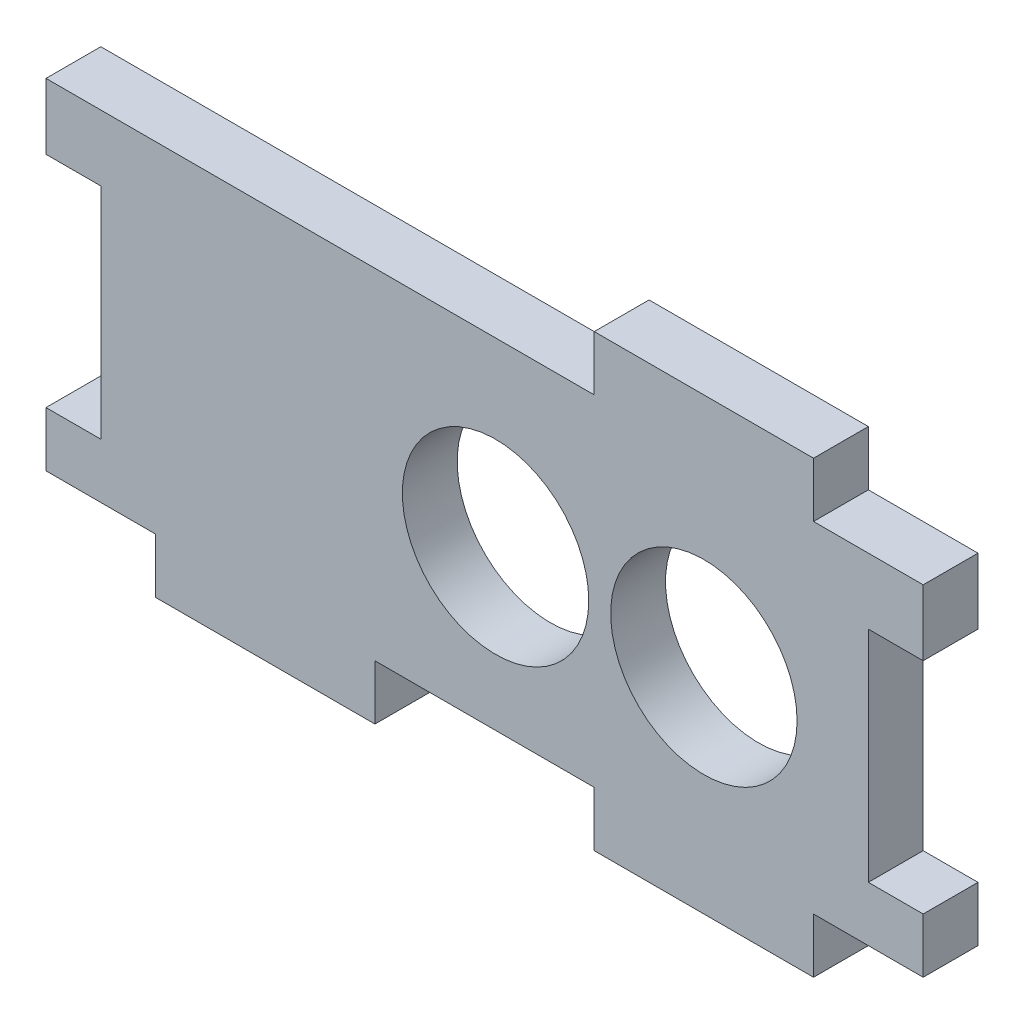
ISO-10303-21;
HEADER;
FILE_DESCRIPTION(('STEP AP214'),'2;1');
FILE_NAME('part.step','',(''),(''),'','','');
FILE_SCHEMA(('AUTOMOTIVE_DESIGN { 1 0 10303 214 1 1 1 1 }'));
ENDSEC;
DATA;
#1=APPLICATION_CONTEXT('core data for automotive mechanical design processes');
#2=APPLICATION_PROTOCOL_DEFINITION('international standard','automotive_design',2000,#1);
#3=PRODUCT_CONTEXT('',#1,'mechanical');
#4=PRODUCT('Part','Part','',(#3));
#5=PRODUCT_RELATED_PRODUCT_CATEGORY('part','',(#4));
#6=PRODUCT_DEFINITION_FORMATION('','',#4);
#7=PRODUCT_DEFINITION_CONTEXT('part definition',#1,'design');
#8=PRODUCT_DEFINITION('design','',#6,#7);
#9=PRODUCT_DEFINITION_SHAPE('','',#8);
#10=(LENGTH_UNIT() NAMED_UNIT(*) SI_UNIT(.MILLI.,.METRE.));
#11=(NAMED_UNIT(*) PLANE_ANGLE_UNIT() SI_UNIT($,.RADIAN.));
#12=(NAMED_UNIT(*) SI_UNIT($,.STERADIAN.) SOLID_ANGLE_UNIT());
#13=UNCERTAINTY_MEASURE_WITH_UNIT(LENGTH_MEASURE(1.E-05),#10,'distance_accuracy_value','');
#14=(GEOMETRIC_REPRESENTATION_CONTEXT(3) GLOBAL_UNCERTAINTY_ASSIGNED_CONTEXT((#13)) GLOBAL_UNIT_ASSIGNED_CONTEXT((#10,
#11,#12)) REPRESENTATION_CONTEXT('',''));
#15=CARTESIAN_POINT('',(0.,0.,0.));
#16=DIRECTION('',(0.,0.,1.));
#17=DIRECTION('',(1.,0.,0.));
#18=AXIS2_PLACEMENT_3D('',#15,#16,#17);
#19=CARTESIAN_POINT('',(50.,0.,-5.));
#20=DIRECTION('',(1.,0.,0.));
#21=DIRECTION('',(0.,0.,-1.));
#22=AXIS2_PLACEMENT_3D('',#19,#20,#21);
#23=PLANE('',#22);
#24=DIRECTION('',(0.,1.,0.));
#25=VECTOR('',#24,1.);
#26=CARTESIAN_POINT('',(50.,0.,0.));
#27=LINE('',#26,#25);
#28=CARTESIAN_POINT('',(50.,31.,0.));
#29=VERTEX_POINT('',#28);
#30=CARTESIAN_POINT('',(50.,36.,0.));
#31=VERTEX_POINT('',#30);
#32=EDGE_CURVE('E233',#29,#31,#27,.T.);
#33=ORIENTED_EDGE('',*,*,#32,.T.);
#34=DIRECTION('',(0.,0.,1.));
#35=VECTOR('',#34,1.);
#36=CARTESIAN_POINT('',(50.,36.,-5.));
#37=LINE('',#36,#35);
#38=CARTESIAN_POINT('',(50.,36.,-5.));
#39=VERTEX_POINT('',#38);
#40=EDGE_CURVE('E11',#39,#31,#37,.T.);
#41=ORIENTED_EDGE('',*,*,#40,.F.);
#42=DIRECTION('',(0.,1.,0.));
#43=VECTOR('',#42,1.);
#44=CARTESIAN_POINT('',(50.,0.,-5.));
#45=LINE('',#44,#43);
#46=CARTESIAN_POINT('',(50.,31.,-5.));
#47=VERTEX_POINT('',#46);
#48=EDGE_CURVE('E294',#47,#39,#45,.T.);
#49=ORIENTED_EDGE('',*,*,#48,.F.);
#50=DIRECTION('',(0.,0.,1.));
#51=VECTOR('',#50,1.);
#52=CARTESIAN_POINT('',(50.,31.,-5.));
#53=LINE('',#52,#51);
#54=EDGE_CURVE('E37',#47,#29,#53,.T.);
#55=ORIENTED_EDGE('',*,*,#54,.T.);
#56=EDGE_LOOP('',(#33,#41,#49,#55));
#57=FACE_BOUND('',#56,.T.);
#58=ADVANCED_FACE('F34',(#57),#23,.F.);
#59=CARTESIAN_POINT('',(0.,36.,-5.));
#60=DIRECTION('',(0.,-1.,0.));
#61=DIRECTION('',(0.,0.,-1.));
#62=AXIS2_PLACEMENT_3D('',#59,#60,#61);
#63=PLANE('',#62);
#64=DIRECTION('',(1.,0.,0.));
#65=VECTOR('',#64,1.);
#66=CARTESIAN_POINT('',(0.,36.,0.));
#67=LINE('',#66,#65);
#68=CARTESIAN_POINT('',(70.,36.,0.));
#69=VERTEX_POINT('',#68);
#70=EDGE_CURVE('E133',#31,#69,#67,.T.);
#71=ORIENTED_EDGE('',*,*,#70,.T.);
#72=DIRECTION('',(0.,0.,1.));
#73=VECTOR('',#72,1.);
#74=CARTESIAN_POINT('',(70.,36.,-5.));
#75=LINE('',#74,#73);
#76=CARTESIAN_POINT('',(70.,36.,-5.));
#77=VERTEX_POINT('',#76);
#78=EDGE_CURVE('E43',#77,#69,#75,.T.);
#79=ORIENTED_EDGE('',*,*,#78,.F.);
#80=DIRECTION('',(1.,0.,0.));
#81=VECTOR('',#80,1.);
#82=CARTESIAN_POINT('',(0.,36.,-5.));
#83=LINE('',#82,#81);
#84=EDGE_CURVE('E51',#39,#77,#83,.T.);
#85=ORIENTED_EDGE('',*,*,#84,.F.);
#86=ORIENTED_EDGE('',*,*,#40,.T.);
#87=EDGE_LOOP('',(#71,#79,#85,#86));
#88=FACE_BOUND('',#87,.T.);
#89=ADVANCED_FACE('F465',(#88),#63,.F.);
#90=CARTESIAN_POINT('',(70.,0.,-5.));
#91=DIRECTION('',(1.,0.,0.));
#92=DIRECTION('',(0.,0.,-1.));
#93=AXIS2_PLACEMENT_3D('',#90,#91,#92);
#94=PLANE('',#93);
#95=DIRECTION('',(0.,1.,0.));
#96=VECTOR('',#95,1.);
#97=CARTESIAN_POINT('',(70.,0.,0.));
#98=LINE('',#97,#96);
#99=CARTESIAN_POINT('',(70.,31.,0.));
#100=VERTEX_POINT('',#99);
#101=EDGE_CURVE('E207',#100,#69,#98,.T.);
#102=ORIENTED_EDGE('',*,*,#101,.F.);
#103=DIRECTION('',(0.,0.,1.));
#104=VECTOR('',#103,1.);
#105=CARTESIAN_POINT('',(70.,31.,-5.));
#106=LINE('',#105,#104);
#107=CARTESIAN_POINT('',(70.,31.,-5.));
#108=VERTEX_POINT('',#107);
#109=EDGE_CURVE('E202',#108,#100,#106,.T.);
#110=ORIENTED_EDGE('',*,*,#109,.F.);
#111=DIRECTION('',(0.,1.,0.));
#112=VECTOR('',#111,1.);
#113=CARTESIAN_POINT('',(70.,0.,-5.));
#114=LINE('',#113,#112);
#115=EDGE_CURVE('E206',#108,#77,#114,.T.);
#116=ORIENTED_EDGE('',*,*,#115,.T.);
#117=ORIENTED_EDGE('',*,*,#78,.T.);
#118=EDGE_LOOP('',(#102,#110,#116,#117));
#119=FACE_BOUND('',#118,.T.);
#120=ADVANCED_FACE('F204',(#119),#94,.T.);
#121=CARTESIAN_POINT('',(0.,31.,-5.));
#122=DIRECTION('',(0.,-1.,0.));
#123=DIRECTION('',(0.,0.,-1.));
#124=AXIS2_PLACEMENT_3D('',#121,#122,#123);
#125=PLANE('',#124);
#126=DIRECTION('',(1.,0.,0.));
#127=VECTOR('',#126,1.);
#128=CARTESIAN_POINT('',(0.,31.,0.));
#129=LINE('',#128,#127);
#130=CARTESIAN_POINT('',(80.,31.,0.));
#131=VERTEX_POINT('',#130);
#132=EDGE_CURVE('E239',#100,#131,#129,.T.);
#133=ORIENTED_EDGE('',*,*,#132,.T.);
#134=DIRECTION('',(0.,0.,1.));
#135=VECTOR('',#134,1.);
#136=CARTESIAN_POINT('',(80.,31.,-5.));
#137=LINE('',#136,#135);
#138=CARTESIAN_POINT('',(80.,31.,-5.));
#139=VERTEX_POINT('',#138);
#140=EDGE_CURVE('E211',#139,#131,#137,.T.);
#141=ORIENTED_EDGE('',*,*,#140,.F.);
#142=DIRECTION('',(1.,0.,0.));
#143=VECTOR('',#142,1.);
#144=CARTESIAN_POINT('',(0.,31.,-5.));
#145=LINE('',#144,#143);
#146=EDGE_CURVE('E214',#108,#139,#145,.T.);
#147=ORIENTED_EDGE('',*,*,#146,.F.);
#148=ORIENTED_EDGE('',*,*,#109,.T.);
#149=EDGE_LOOP('',(#133,#141,#147,#148));
#150=FACE_BOUND('',#149,.T.);
#151=ADVANCED_FACE('F215',(#150),#125,.F.);
#152=CARTESIAN_POINT('',(80.,0.,-5.));
#153=DIRECTION('',(1.,0.,0.));
#154=DIRECTION('',(0.,0.,-1.));
#155=AXIS2_PLACEMENT_3D('',#152,#153,#154);
#156=PLANE('',#155);
#157=DIRECTION('',(0.,1.,0.));
#158=VECTOR('',#157,1.);
#159=CARTESIAN_POINT('',(80.,0.,0.));
#160=LINE('',#159,#158);
#161=CARTESIAN_POINT('',(80.,25.,0.));
#162=VERTEX_POINT('',#161);
#163=EDGE_CURVE('E284',#162,#131,#160,.T.);
#164=ORIENTED_EDGE('',*,*,#163,.F.);
#165=DIRECTION('',(0.,0.,1.));
#166=VECTOR('',#165,1.);
#167=CARTESIAN_POINT('',(80.,25.,-5.));
#168=LINE('',#167,#166);
#169=CARTESIAN_POINT('',(80.,25.,-5.));
#170=VERTEX_POINT('',#169);
#171=EDGE_CURVE('E298',#170,#162,#168,.T.);
#172=ORIENTED_EDGE('',*,*,#171,.F.);
#173=DIRECTION('',(0.,1.,0.));
#174=VECTOR('',#173,1.);
#175=CARTESIAN_POINT('',(80.,0.,-5.));
#176=LINE('',#175,#174);
#177=EDGE_CURVE('E218',#170,#139,#176,.T.);
#178=ORIENTED_EDGE('',*,*,#177,.T.);
#179=ORIENTED_EDGE('',*,*,#140,.T.);
#180=EDGE_LOOP('',(#164,#172,#178,#179));
#181=FACE_BOUND('',#180,.T.);
#182=ADVANCED_FACE('F441',(#181),#156,.T.);
#183=CARTESIAN_POINT('',(0.,25.,-5.));
#184=DIRECTION('',(0.,1.,0.));
#185=DIRECTION('',(0.,0.,1.));
#186=AXIS2_PLACEMENT_3D('',#183,#184,#185);
#187=PLANE('',#186);
#188=DIRECTION('',(-1.,0.,0.));
#189=VECTOR('',#188,1.);
#190=CARTESIAN_POINT('',(0.,25.,0.));
#191=LINE('',#190,#189);
#192=CARTESIAN_POINT('',(75.,25.,0.));
#193=VERTEX_POINT('',#192);
#194=EDGE_CURVE('E282',#162,#193,#191,.T.);
#195=ORIENTED_EDGE('',*,*,#194,.T.);
#196=DIRECTION('',(0.,0.,1.));
#197=VECTOR('',#196,1.);
#198=CARTESIAN_POINT('',(75.,25.,-5.));
#199=LINE('',#198,#197);
#200=CARTESIAN_POINT('',(75.,25.,-5.));
#201=VERTEX_POINT('',#200);
#202=EDGE_CURVE('E300',#201,#193,#199,.T.);
#203=ORIENTED_EDGE('',*,*,#202,.F.);
#204=DIRECTION('',(-1.,0.,0.));
#205=VECTOR('',#204,1.);
#206=CARTESIAN_POINT('',(0.,25.,-5.));
#207=LINE('',#206,#205);
#208=EDGE_CURVE('E439',#170,#201,#207,.T.);
#209=ORIENTED_EDGE('',*,*,#208,.F.);
#210=ORIENTED_EDGE('',*,*,#171,.T.);
#211=EDGE_LOOP('',(#195,#203,#209,#210));
#212=FACE_BOUND('',#211,.T.);
#213=ADVANCED_FACE('F438',(#212),#187,.F.);
#214=CARTESIAN_POINT('',(75.,0.,-5.));
#215=DIRECTION('',(-1.,0.,0.));
#216=DIRECTION('',(0.,0.,1.));
#217=AXIS2_PLACEMENT_3D('',#214,#215,#216);
#218=PLANE('',#217);
#219=DIRECTION('',(0.,-1.,0.));
#220=VECTOR('',#219,1.);
#221=CARTESIAN_POINT('',(75.,0.,0.));
#222=LINE('',#221,#220);
#223=CARTESIAN_POINT('',(75.,5.00000000000001,0.));
#224=VERTEX_POINT('',#223);
#225=EDGE_CURVE('E279',#193,#224,#222,.T.);
#226=ORIENTED_EDGE('',*,*,#225,.T.);
#227=DIRECTION('',(0.,0.,1.));
#228=VECTOR('',#227,1.);
#229=CARTESIAN_POINT('',(75.,5.00000000000001,-5.));
#230=LINE('',#229,#228);
#231=CARTESIAN_POINT('',(75.,5.00000000000001,-5.));
#232=VERTEX_POINT('',#231);
#233=EDGE_CURVE('E303',#232,#224,#230,.T.);
#234=ORIENTED_EDGE('',*,*,#233,.F.);
#235=DIRECTION('',(0.,-1.,0.));
#236=VECTOR('',#235,1.);
#237=CARTESIAN_POINT('',(75.,0.,-5.));
#238=LINE('',#237,#236);
#239=EDGE_CURVE('E435',#201,#232,#238,.T.);
#240=ORIENTED_EDGE('',*,*,#239,.F.);
#241=ORIENTED_EDGE('',*,*,#202,.T.);
#242=EDGE_LOOP('',(#226,#234,#240,#241));
#243=FACE_BOUND('',#242,.T.);
#244=ADVANCED_FACE('F432',(#243),#218,.F.);
#245=CARTESIAN_POINT('',(0.,5.,-5.));
#246=DIRECTION('',(0.,1.,0.));
#247=DIRECTION('',(-1.,0.,0.));
#248=AXIS2_PLACEMENT_3D('',#245,#246,#247);
#249=PLANE('',#248);
#250=DIRECTION('',(-1.,0.,0.));
#251=VECTOR('',#250,1.);
#252=CARTESIAN_POINT('',(0.,5.,0.));
#253=LINE('',#252,#251);
#254=CARTESIAN_POINT('',(80.,5.00000000000002,0.));
#255=VERTEX_POINT('',#254);
#256=EDGE_CURVE('E276',#255,#224,#253,.T.);
#257=ORIENTED_EDGE('',*,*,#256,.F.);
#258=DIRECTION('',(0.,0.,1.));
#259=VECTOR('',#258,1.);
#260=CARTESIAN_POINT('',(80.,5.00000000000002,-5.));
#261=LINE('',#260,#259);
#262=CARTESIAN_POINT('',(80.,5.00000000000002,-5.));
#263=VERTEX_POINT('',#262);
#264=EDGE_CURVE('E305',#263,#255,#261,.T.);
#265=ORIENTED_EDGE('',*,*,#264,.F.);
#266=DIRECTION('',(-1.,0.,0.));
#267=VECTOR('',#266,1.);
#268=CARTESIAN_POINT('',(0.,5.,-5.));
#269=LINE('',#268,#267);
#270=EDGE_CURVE('E442',#263,#232,#269,.T.);
#271=ORIENTED_EDGE('',*,*,#270,.T.);
#272=ORIENTED_EDGE('',*,*,#233,.T.);
#273=EDGE_LOOP('',(#257,#265,#271,#272));
#274=FACE_BOUND('',#273,.T.);
#275=ADVANCED_FACE('F426',(#274),#249,.T.);
#276=CARTESIAN_POINT('',(80.,0.,-5.));
#277=DIRECTION('',(1.,0.,0.));
#278=DIRECTION('',(0.,0.,-1.));
#279=AXIS2_PLACEMENT_3D('',#276,#277,#278);
#280=PLANE('',#279);
#281=DIRECTION('',(0.,1.,0.));
#282=VECTOR('',#281,1.);
#283=CARTESIAN_POINT('',(80.,0.,0.));
#284=LINE('',#283,#282);
#285=CARTESIAN_POINT('',(80.,0.,0.));
#286=VERTEX_POINT('',#285);
#287=EDGE_CURVE('E273',#286,#255,#284,.T.);
#288=ORIENTED_EDGE('',*,*,#287,.F.);
#289=DIRECTION('',(0.,0.,1.));
#290=VECTOR('',#289,1.);
#291=CARTESIAN_POINT('',(80.,0.,-5.));
#292=LINE('',#291,#290);
#293=CARTESIAN_POINT('',(80.,0.,-5.));
#294=VERTEX_POINT('',#293);
#295=EDGE_CURVE('E307',#294,#286,#292,.T.);
#296=ORIENTED_EDGE('',*,*,#295,.F.);
#297=DIRECTION('',(0.,1.,0.));
#298=VECTOR('',#297,1.);
#299=CARTESIAN_POINT('',(80.,0.,-5.));
#300=LINE('',#299,#298);
#301=EDGE_CURVE('E422',#294,#263,#300,.T.);
#302=ORIENTED_EDGE('',*,*,#301,.T.);
#303=ORIENTED_EDGE('',*,*,#264,.T.);
#304=EDGE_LOOP('',(#288,#296,#302,#303));
#305=FACE_BOUND('',#304,.T.);
#306=ADVANCED_FACE('F420',(#305),#280,.T.);
#307=CARTESIAN_POINT('',(0.,0.,-5.));
#308=DIRECTION('',(0.,-1.,0.));
#309=DIRECTION('',(1.,0.,0.));
#310=AXIS2_PLACEMENT_3D('',#307,#308,#309);
#311=PLANE('',#310);
#312=DIRECTION('',(1.,0.,0.));
#313=VECTOR('',#312,1.);
#314=CARTESIAN_POINT('',(0.,0.,0.));
#315=LINE('',#314,#313);
#316=CARTESIAN_POINT('',(70.,0.,0.));
#317=VERTEX_POINT('',#316);
#318=EDGE_CURVE('E256',#317,#286,#315,.T.);
#319=ORIENTED_EDGE('',*,*,#318,.F.);
#320=DIRECTION('',(0.,0.,1.));
#321=VECTOR('',#320,1.);
#322=CARTESIAN_POINT('',(70.,0.,-5.));
#323=LINE('',#322,#321);
#324=CARTESIAN_POINT('',(70.,0.,-5.));
#325=VERTEX_POINT('',#324);
#326=EDGE_CURVE('E309',#325,#317,#323,.T.);
#327=ORIENTED_EDGE('',*,*,#326,.F.);
#328=DIRECTION('',(1.,0.,0.));
#329=VECTOR('',#328,1.);
#330=CARTESIAN_POINT('',(0.,0.,-5.));
#331=LINE('',#330,#329);
#332=EDGE_CURVE('E416',#325,#294,#331,.T.);
#333=ORIENTED_EDGE('',*,*,#332,.T.);
#334=ORIENTED_EDGE('',*,*,#295,.T.);
#335=EDGE_LOOP('',(#319,#327,#333,#334));
#336=FACE_BOUND('',#335,.T.);
#337=ADVANCED_FACE('F412',(#336),#311,.T.);
#338=CARTESIAN_POINT('',(70.,0.,-5.));
#339=DIRECTION('',(-1.,0.,0.));
#340=DIRECTION('',(0.,0.,1.));
#341=AXIS2_PLACEMENT_3D('',#338,#339,#340);
#342=PLANE('',#341);
#343=DIRECTION('',(0.,-1.,0.));
#344=VECTOR('',#343,1.);
#345=CARTESIAN_POINT('',(70.,0.,0.));
#346=LINE('',#345,#344);
#347=CARTESIAN_POINT('',(70.,-5.,0.));
#348=VERTEX_POINT('',#347);
#349=EDGE_CURVE('E271',#317,#348,#346,.T.);
#350=ORIENTED_EDGE('',*,*,#349,.T.);
#351=DIRECTION('',(0.,0.,1.));
#352=VECTOR('',#351,1.);
#353=CARTESIAN_POINT('',(70.,-5.,-5.));
#354=LINE('',#353,#352);
#355=CARTESIAN_POINT('',(70.,-5.,-5.));
#356=VERTEX_POINT('',#355);
#357=EDGE_CURVE('E311',#356,#348,#354,.T.);
#358=ORIENTED_EDGE('',*,*,#357,.F.);
#359=DIRECTION('',(0.,-1.,0.));
#360=VECTOR('',#359,1.);
#361=CARTESIAN_POINT('',(70.,0.,-5.));
#362=LINE('',#361,#360);
#363=EDGE_CURVE('E447',#325,#356,#362,.T.);
#364=ORIENTED_EDGE('',*,*,#363,.F.);
#365=ORIENTED_EDGE('',*,*,#326,.T.);
#366=EDGE_LOOP('',(#350,#358,#364,#365));
#367=FACE_BOUND('',#366,.T.);
#368=ADVANCED_FACE('F492',(#367),#342,.F.);
#369=CARTESIAN_POINT('',(0.,-5.00000000000001,-5.));
#370=DIRECTION('',(0.,1.,0.));
#371=DIRECTION('',(-1.,0.,0.));
#372=AXIS2_PLACEMENT_3D('',#369,#370,#371);
#373=PLANE('',#372);
#374=DIRECTION('',(-1.,0.,0.));
#375=VECTOR('',#374,1.);
#376=CARTESIAN_POINT('',(0.,-5.00000000000001,0.));
#377=LINE('',#376,#375);
#378=CARTESIAN_POINT('',(50.,-5.,0.));
#379=VERTEX_POINT('',#378);
#380=EDGE_CURVE('E268',#348,#379,#377,.T.);
#381=ORIENTED_EDGE('',*,*,#380,.T.);
#382=DIRECTION('',(0.,0.,1.));
#383=VECTOR('',#382,1.);
#384=CARTESIAN_POINT('',(50.,-5.,-5.));
#385=LINE('',#384,#383);
#386=CARTESIAN_POINT('',(50.,-5.,-5.));
#387=VERTEX_POINT('',#386);
#388=EDGE_CURVE('E314',#387,#379,#385,.T.);
#389=ORIENTED_EDGE('',*,*,#388,.F.);
#390=DIRECTION('',(-1.,0.,0.));
#391=VECTOR('',#390,1.);
#392=CARTESIAN_POINT('',(0.,-5.00000000000001,-5.));
#393=LINE('',#392,#391);
#394=EDGE_CURVE('E449',#356,#387,#393,.T.);
#395=ORIENTED_EDGE('',*,*,#394,.F.);
#396=ORIENTED_EDGE('',*,*,#357,.T.);
#397=EDGE_LOOP('',(#381,#389,#395,#396));
#398=FACE_BOUND('',#397,.T.);
#399=ADVANCED_FACE('F495',(#398),#373,.F.);
#400=CARTESIAN_POINT('',(50.,0.,-5.));
#401=DIRECTION('',(-1.,0.,0.));
#402=DIRECTION('',(0.,0.,1.));
#403=AXIS2_PLACEMENT_3D('',#400,#401,#402);
#404=PLANE('',#403);
#405=DIRECTION('',(0.,-1.,0.));
#406=VECTOR('',#405,1.);
#407=CARTESIAN_POINT('',(50.,0.,0.));
#408=LINE('',#407,#406);
#409=CARTESIAN_POINT('',(50.,0.,0.));
#410=VERTEX_POINT('',#409);
#411=EDGE_CURVE('E265',#410,#379,#408,.T.);
#412=ORIENTED_EDGE('',*,*,#411,.F.);
#413=DIRECTION('',(0.,0.,1.));
#414=VECTOR('',#413,1.);
#415=CARTESIAN_POINT('',(50.,0.,-5.));
#416=LINE('',#415,#414);
#417=CARTESIAN_POINT('',(50.,0.,-5.));
#418=VERTEX_POINT('',#417);
#419=EDGE_CURVE('E316',#418,#410,#416,.T.);
#420=ORIENTED_EDGE('',*,*,#419,.F.);
#421=DIRECTION('',(0.,-1.,0.));
#422=VECTOR('',#421,1.);
#423=CARTESIAN_POINT('',(50.,0.,-5.));
#424=LINE('',#423,#422);
#425=EDGE_CURVE('E451',#418,#387,#424,.T.);
#426=ORIENTED_EDGE('',*,*,#425,.T.);
#427=ORIENTED_EDGE('',*,*,#388,.T.);
#428=EDGE_LOOP('',(#412,#420,#426,#427));
#429=FACE_BOUND('',#428,.T.);
#430=ADVANCED_FACE('F499',(#429),#404,.T.);
#431=CARTESIAN_POINT('',(30.,0.,0.));
#432=VERTEX_POINT('',#431);
#433=EDGE_CURVE('E257',#432,#410,#315,.T.);
#434=ORIENTED_EDGE('',*,*,#433,.F.);
#435=DIRECTION('',(0.,0.,1.));
#436=VECTOR('',#435,1.);
#437=CARTESIAN_POINT('',(30.,0.,-5.));
#438=LINE('',#437,#436);
#439=CARTESIAN_POINT('',(30.,0.,-5.));
#440=VERTEX_POINT('',#439);
#441=EDGE_CURVE('E318',#440,#432,#438,.T.);
#442=ORIENTED_EDGE('',*,*,#441,.F.);
#443=EDGE_CURVE('E404',#440,#418,#331,.T.);
#444=ORIENTED_EDGE('',*,*,#443,.T.);
#445=ORIENTED_EDGE('',*,*,#419,.T.);
#446=EDGE_LOOP('',(#434,#442,#444,#445));
#447=FACE_BOUND('',#446,.T.);
#448=ADVANCED_FACE('F403',(#447),#311,.T.);
#449=CARTESIAN_POINT('',(30.,0.,-5.));
#450=DIRECTION('',(-1.,0.,0.));
#451=DIRECTION('',(0.,0.,1.));
#452=AXIS2_PLACEMENT_3D('',#449,#450,#451);
#453=PLANE('',#452);
#454=DIRECTION('',(0.,-1.,0.));
#455=VECTOR('',#454,1.);
#456=CARTESIAN_POINT('',(30.,0.,0.));
#457=LINE('',#456,#455);
#458=CARTESIAN_POINT('',(30.,-5.,0.));
#459=VERTEX_POINT('',#458);
#460=EDGE_CURVE('E263',#432,#459,#457,.T.);
#461=ORIENTED_EDGE('',*,*,#460,.T.);
#462=DIRECTION('',(0.,0.,1.));
#463=VECTOR('',#462,1.);
#464=CARTESIAN_POINT('',(30.,-5.,-5.));
#465=LINE('',#464,#463);
#466=CARTESIAN_POINT('',(30.,-5.,-5.));
#467=VERTEX_POINT('',#466);
#468=EDGE_CURVE('E320',#467,#459,#465,.T.);
#469=ORIENTED_EDGE('',*,*,#468,.F.);
#470=DIRECTION('',(0.,-1.,0.));
#471=VECTOR('',#470,1.);
#472=CARTESIAN_POINT('',(30.,0.,-5.));
#473=LINE('',#472,#471);
#474=EDGE_CURVE('E399',#440,#467,#473,.T.);
#475=ORIENTED_EDGE('',*,*,#474,.F.);
#476=ORIENTED_EDGE('',*,*,#441,.T.);
#477=EDGE_LOOP('',(#461,#469,#475,#476));
#478=FACE_BOUND('',#477,.T.);
#479=ADVANCED_FACE('F398',(#478),#453,.F.);
#480=CARTESIAN_POINT('',(0.,-5.,-5.));
#481=DIRECTION('',(0.,1.,0.));
#482=DIRECTION('',(-1.,0.,0.));
#483=AXIS2_PLACEMENT_3D('',#480,#481,#482);
#484=PLANE('',#483);
#485=DIRECTION('',(-1.,0.,0.));
#486=VECTOR('',#485,1.);
#487=CARTESIAN_POINT('',(0.,-5.,0.));
#488=LINE('',#487,#486);
#489=CARTESIAN_POINT('',(10.,-5.,0.));
#490=VERTEX_POINT('',#489);
#491=EDGE_CURVE('E260',#459,#490,#488,.T.);
#492=ORIENTED_EDGE('',*,*,#491,.T.);
#493=DIRECTION('',(0.,0.,1.));
#494=VECTOR('',#493,1.);
#495=CARTESIAN_POINT('',(10.,-5.,-5.));
#496=LINE('',#495,#494);
#497=CARTESIAN_POINT('',(10.,-5.,-5.));
#498=VERTEX_POINT('',#497);
#499=EDGE_CURVE('E323',#498,#490,#496,.T.);
#500=ORIENTED_EDGE('',*,*,#499,.F.);
#501=DIRECTION('',(-1.,0.,0.));
#502=VECTOR('',#501,1.);
#503=CARTESIAN_POINT('',(0.,-5.,-5.));
#504=LINE('',#503,#502);
#505=EDGE_CURVE('E395',#467,#498,#504,.T.);
#506=ORIENTED_EDGE('',*,*,#505,.F.);
#507=ORIENTED_EDGE('',*,*,#468,.T.);
#508=EDGE_LOOP('',(#492,#500,#506,#507));
#509=FACE_BOUND('',#508,.T.);
#510=ADVANCED_FACE('F392',(#509),#484,.F.);
#511=CARTESIAN_POINT('',(10.,0.,-5.));
#512=DIRECTION('',(-1.,0.,0.));
#513=DIRECTION('',(0.,-1.,0.));
#514=AXIS2_PLACEMENT_3D('',#511,#512,#513);
#515=PLANE('',#514);
#516=DIRECTION('',(0.,-1.,0.));
#517=VECTOR('',#516,1.);
#518=CARTESIAN_POINT('',(10.,0.,0.));
#519=LINE('',#518,#517);
#520=CARTESIAN_POINT('',(10.,0.,0.));
#521=VERTEX_POINT('',#520);
#522=EDGE_CURVE('E255',#521,#490,#519,.T.);
#523=ORIENTED_EDGE('',*,*,#522,.F.);
#524=DIRECTION('',(0.,0.,1.));
#525=VECTOR('',#524,1.);
#526=CARTESIAN_POINT('',(10.,0.,-5.));
#527=LINE('',#526,#525);
#528=CARTESIAN_POINT('',(10.,0.,-5.));
#529=VERTEX_POINT('',#528);
#530=EDGE_CURVE('E325',#529,#521,#527,.T.);
#531=ORIENTED_EDGE('',*,*,#530,.F.);
#532=DIRECTION('',(0.,-1.,0.));
#533=VECTOR('',#532,1.);
#534=CARTESIAN_POINT('',(10.,0.,-5.));
#535=LINE('',#534,#533);
#536=EDGE_CURVE('E456',#529,#498,#535,.T.);
#537=ORIENTED_EDGE('',*,*,#536,.T.);
#538=ORIENTED_EDGE('',*,*,#499,.T.);
#539=EDGE_LOOP('',(#523,#531,#537,#538));
#540=FACE_BOUND('',#539,.T.);
#541=ADVANCED_FACE('F385',(#540),#515,.T.);
#542=CARTESIAN_POINT('',(0.,0.,0.));
#543=VERTEX_POINT('',#542);
#544=EDGE_CURVE('E252',#543,#521,#315,.T.);
#545=ORIENTED_EDGE('',*,*,#544,.F.);
#546=DIRECTION('',(0.,0.,1.));
#547=VECTOR('',#546,1.);
#548=CARTESIAN_POINT('',(0.,0.,-5.));
#549=LINE('',#548,#547);
#550=CARTESIAN_POINT('',(0.,0.,-5.));
#551=VERTEX_POINT('',#550);
#552=EDGE_CURVE('E327',#551,#543,#549,.T.);
#553=ORIENTED_EDGE('',*,*,#552,.F.);
#554=EDGE_CURVE('E381',#551,#529,#331,.T.);
#555=ORIENTED_EDGE('',*,*,#554,.T.);
#556=ORIENTED_EDGE('',*,*,#530,.T.);
#557=EDGE_LOOP('',(#545,#553,#555,#556));
#558=FACE_BOUND('',#557,.T.);
#559=ADVANCED_FACE('F378',(#558),#311,.T.);
#560=CARTESIAN_POINT('',(0.,0.,-5.));
#561=DIRECTION('',(1.,0.,0.));
#562=DIRECTION('',(0.,0.,-1.));
#563=AXIS2_PLACEMENT_3D('',#560,#561,#562);
#564=PLANE('',#563);
#565=DIRECTION('',(0.,1.,0.));
#566=VECTOR('',#565,1.);
#567=CARTESIAN_POINT('',(0.,0.,0.));
#568=LINE('',#567,#566);
#569=CARTESIAN_POINT('',(0.,5.,0.));
#570=VERTEX_POINT('',#569);
#571=EDGE_CURVE('E250',#543,#570,#568,.T.);
#572=ORIENTED_EDGE('',*,*,#571,.T.);
#573=DIRECTION('',(0.,0.,1.));
#574=VECTOR('',#573,1.);
#575=CARTESIAN_POINT('',(0.,5.,-5.));
#576=LINE('',#575,#574);
#577=CARTESIAN_POINT('',(0.,5.,-5.));
#578=VERTEX_POINT('',#577);
#579=EDGE_CURVE('E329',#578,#570,#576,.T.);
#580=ORIENTED_EDGE('',*,*,#579,.F.);
#581=DIRECTION('',(0.,1.,0.));
#582=VECTOR('',#581,1.);
#583=CARTESIAN_POINT('',(0.,0.,-5.));
#584=LINE('',#583,#582);
#585=EDGE_CURVE('E374',#551,#578,#584,.T.);
#586=ORIENTED_EDGE('',*,*,#585,.F.);
#587=ORIENTED_EDGE('',*,*,#552,.T.);
#588=EDGE_LOOP('',(#572,#580,#586,#587));
#589=FACE_BOUND('',#588,.T.);
#590=ADVANCED_FACE('F373',(#589),#564,.F.);
#591=CARTESIAN_POINT('',(0.,5.,-5.));
#592=DIRECTION('',(0.,-1.,0.));
#593=DIRECTION('',(0.,0.,-1.));
#594=AXIS2_PLACEMENT_3D('',#591,#592,#593);
#595=PLANE('',#594);
#596=DIRECTION('',(1.,0.,0.));
#597=VECTOR('',#596,1.);
#598=CARTESIAN_POINT('',(0.,5.,0.));
#599=LINE('',#598,#597);
#600=CARTESIAN_POINT('',(5.,5.,0.));
#601=VERTEX_POINT('',#600);
#602=EDGE_CURVE('E248',#570,#601,#599,.T.);
#603=ORIENTED_EDGE('',*,*,#602,.T.);
#604=DIRECTION('',(0.,0.,1.));
#605=VECTOR('',#604,1.);
#606=CARTESIAN_POINT('',(5.,5.,-5.));
#607=LINE('',#606,#605);
#608=CARTESIAN_POINT('',(5.,5.,-5.));
#609=VERTEX_POINT('',#608);
#610=EDGE_CURVE('E332',#609,#601,#607,.T.);
#611=ORIENTED_EDGE('',*,*,#610,.F.);
#612=DIRECTION('',(1.,0.,0.));
#613=VECTOR('',#612,1.);
#614=CARTESIAN_POINT('',(0.,5.,-5.));
#615=LINE('',#614,#613);
#616=EDGE_CURVE('E369',#578,#609,#615,.T.);
#617=ORIENTED_EDGE('',*,*,#616,.F.);
#618=ORIENTED_EDGE('',*,*,#579,.T.);
#619=EDGE_LOOP('',(#603,#611,#617,#618));
#620=FACE_BOUND('',#619,.T.);
#621=ADVANCED_FACE('F368',(#620),#595,.F.);
#622=CARTESIAN_POINT('',(5.,0.,-5.));
#623=DIRECTION('',(1.,0.,0.));
#624=DIRECTION('',(0.,1.,0.));
#625=AXIS2_PLACEMENT_3D('',#622,#623,#624);
#626=PLANE('',#625);
#627=DIRECTION('',(0.,1.,0.));
#628=VECTOR('',#627,1.);
#629=CARTESIAN_POINT('',(5.,0.,0.));
#630=LINE('',#629,#628);
#631=CARTESIAN_POINT('',(5.,25.,0.));
#632=VERTEX_POINT('',#631);
#633=EDGE_CURVE('E245',#601,#632,#630,.T.);
#634=ORIENTED_EDGE('',*,*,#633,.T.);
#635=DIRECTION('',(0.,0.,1.));
#636=VECTOR('',#635,1.);
#637=CARTESIAN_POINT('',(5.,25.,-5.));
#638=LINE('',#637,#636);
#639=CARTESIAN_POINT('',(5.,25.,-5.));
#640=VERTEX_POINT('',#639);
#641=EDGE_CURVE('E335',#640,#632,#638,.T.);
#642=ORIENTED_EDGE('',*,*,#641,.F.);
#643=DIRECTION('',(0.,1.,0.));
#644=VECTOR('',#643,1.);
#645=CARTESIAN_POINT('',(5.,0.,-5.));
#646=LINE('',#645,#644);
#647=EDGE_CURVE('E365',#609,#640,#646,.T.);
#648=ORIENTED_EDGE('',*,*,#647,.F.);
#649=ORIENTED_EDGE('',*,*,#610,.T.);
#650=EDGE_LOOP('',(#634,#642,#648,#649));
#651=FACE_BOUND('',#650,.T.);
#652=ADVANCED_FACE('F362',(#651),#626,.F.);
#653=CARTESIAN_POINT('',(0.,25.,-5.));
#654=DIRECTION('',(0.,-1.,0.));
#655=DIRECTION('',(0.,0.,-1.));
#656=AXIS2_PLACEMENT_3D('',#653,#654,#655);
#657=PLANE('',#656);
#658=DIRECTION('',(1.,0.,0.));
#659=VECTOR('',#658,1.);
#660=CARTESIAN_POINT('',(0.,25.,0.));
#661=LINE('',#660,#659);
#662=CARTESIAN_POINT('',(0.,25.,0.));
#663=VERTEX_POINT('',#662);
#664=EDGE_CURVE('E242',#663,#632,#661,.T.);
#665=ORIENTED_EDGE('',*,*,#664,.F.);
#666=DIRECTION('',(0.,0.,1.));
#667=VECTOR('',#666,1.);
#668=CARTESIAN_POINT('',(0.,25.,-5.));
#669=LINE('',#668,#667);
#670=CARTESIAN_POINT('',(0.,25.,-5.));
#671=VERTEX_POINT('',#670);
#672=EDGE_CURVE('E337',#671,#663,#669,.T.);
#673=ORIENTED_EDGE('',*,*,#672,.F.);
#674=DIRECTION('',(1.,0.,0.));
#675=VECTOR('',#674,1.);
#676=CARTESIAN_POINT('',(0.,25.,-5.));
#677=LINE('',#676,#675);
#678=EDGE_CURVE('E462',#671,#640,#677,.T.);
#679=ORIENTED_EDGE('',*,*,#678,.T.);
#680=ORIENTED_EDGE('',*,*,#641,.T.);
#681=EDGE_LOOP('',(#665,#673,#679,#680));
#682=FACE_BOUND('',#681,.T.);
#683=ADVANCED_FACE('F356',(#682),#657,.T.);
#684=CARTESIAN_POINT('',(0.,0.,-5.));
#685=DIRECTION('',(-1.,0.,0.));
#686=DIRECTION('',(0.,-1.,0.));
#687=AXIS2_PLACEMENT_3D('',#684,#685,#686);
#688=PLANE('',#687);
#689=DIRECTION('',(0.,-1.,0.));
#690=VECTOR('',#689,1.);
#691=CARTESIAN_POINT('',(0.,0.,0.));
#692=LINE('',#691,#690);
#693=CARTESIAN_POINT('',(0.,31.,0.));
#694=VERTEX_POINT('',#693);
#695=EDGE_CURVE('E238',#694,#663,#692,.T.);
#696=ORIENTED_EDGE('',*,*,#695,.F.);
#697=DIRECTION('',(0.,0.,1.));
#698=VECTOR('',#697,1.);
#699=CARTESIAN_POINT('',(0.,31.,-5.));
#700=LINE('',#699,#698);
#701=CARTESIAN_POINT('',(0.,31.,-5.));
#702=VERTEX_POINT('',#701);
#703=EDGE_CURVE('E338',#702,#694,#700,.T.);
#704=ORIENTED_EDGE('',*,*,#703,.F.);
#705=DIRECTION('',(0.,-1.,0.));
#706=VECTOR('',#705,1.);
#707=CARTESIAN_POINT('',(0.,0.,-5.));
#708=LINE('',#707,#706);
#709=EDGE_CURVE('E352',#702,#671,#708,.T.);
#710=ORIENTED_EDGE('',*,*,#709,.T.);
#711=ORIENTED_EDGE('',*,*,#672,.T.);
#712=EDGE_LOOP('',(#696,#704,#710,#711));
#713=FACE_BOUND('',#712,.T.);
#714=ADVANCED_FACE('F349',(#713),#688,.T.);
#715=CARTESIAN_POINT('',(41.,14.5,-5.));
#716=DIRECTION('',(0.,0.,1.));
#717=DIRECTION('',(1.,0.,0.));
#718=AXIS2_PLACEMENT_3D('',#715,#716,#717);
#719=CYLINDRICAL_SURFACE('',#718,8.50000000000003);
#720=CARTESIAN_POINT('',(41.,14.5,-5.));
#721=DIRECTION('',(0.,0.,1.));
#722=DIRECTION('',(1.,0.,0.));
#723=AXIS2_PLACEMENT_3D('',#720,#721,#722);
#724=CIRCLE('',#723,8.50000000000003);
#725=CARTESIAN_POINT('',(49.5,14.5,-5.));
#726=VERTEX_POINT('',#725);
#727=EDGE_CURVE('E223',#726,#726,#724,.T.);
#728=ORIENTED_EDGE('',*,*,#727,.F.);
#729=EDGE_LOOP('',(#728));
#730=FACE_BOUND('',#729,.T.);
#731=CARTESIAN_POINT('',(41.,14.5,0.));
#732=DIRECTION('',(0.,0.,1.));
#733=DIRECTION('',(1.,0.,0.));
#734=AXIS2_PLACEMENT_3D('',#731,#732,#733);
#735=CIRCLE('',#734,8.50000000000003);
#736=CARTESIAN_POINT('',(49.5,14.5,0.));
#737=VERTEX_POINT('',#736);
#738=EDGE_CURVE('E289',#737,#737,#735,.T.);
#739=ORIENTED_EDGE('',*,*,#738,.T.);
#740=EDGE_LOOP('',(#739));
#741=FACE_BOUND('',#740,.T.);
#742=ADVANCED_FACE('F474',(#730,#741),#719,.F.);
#743=EDGE_CURVE('E236',#694,#29,#129,.T.);
#744=ORIENTED_EDGE('',*,*,#743,.T.);
#745=ORIENTED_EDGE('',*,*,#54,.F.);
#746=EDGE_CURVE('E140',#702,#47,#145,.T.);
#747=ORIENTED_EDGE('',*,*,#746,.F.);
#748=ORIENTED_EDGE('',*,*,#703,.T.);
#749=EDGE_LOOP('',(#744,#745,#747,#748));
#750=FACE_BOUND('',#749,.T.);
#751=ADVANCED_FACE('F479',(#750),#125,.F.);
#752=CARTESIAN_POINT('',(60.,14.5,-5.));
#753=DIRECTION('',(0.,0.,1.));
#754=DIRECTION('',(1.,0.,0.));
#755=AXIS2_PLACEMENT_3D('',#752,#753,#754);
#756=CYLINDRICAL_SURFACE('',#755,8.50000000000003);
#757=CARTESIAN_POINT('',(60.,14.5,-5.));
#758=DIRECTION('',(0.,0.,1.));
#759=DIRECTION('',(1.,0.,0.));
#760=AXIS2_PLACEMENT_3D('',#757,#758,#759);
#761=CIRCLE('',#760,8.50000000000003);
#762=CARTESIAN_POINT('',(68.5,14.5,-5.));
#763=VERTEX_POINT('',#762);
#764=EDGE_CURVE('E230',#763,#763,#761,.T.);
#765=ORIENTED_EDGE('',*,*,#764,.F.);
#766=EDGE_LOOP('',(#765));
#767=FACE_BOUND('',#766,.T.);
#768=CARTESIAN_POINT('',(60.,14.5,0.));
#769=DIRECTION('',(0.,0.,1.));
#770=DIRECTION('',(1.,0.,0.));
#771=AXIS2_PLACEMENT_3D('',#768,#769,#770);
#772=CIRCLE('',#771,8.50000000000003);
#773=CARTESIAN_POINT('',(68.5,14.5,0.));
#774=VERTEX_POINT('',#773);
#775=EDGE_CURVE('E292',#774,#774,#772,.T.);
#776=ORIENTED_EDGE('',*,*,#775,.T.);
#777=EDGE_LOOP('',(#776));
#778=FACE_BOUND('',#777,.T.);
#779=ADVANCED_FACE('F525',(#767,#778),#756,.F.);
#780=CARTESIAN_POINT('',(0.,0.,-5.));
#781=DIRECTION('',(0.,0.,1.));
#782=DIRECTION('',(1.,0.,0.));
#783=AXIS2_PLACEMENT_3D('',#780,#781,#782);
#784=PLANE('',#783);
#785=ORIENTED_EDGE('',*,*,#48,.T.);
#786=ORIENTED_EDGE('',*,*,#84,.T.);
#787=ORIENTED_EDGE('',*,*,#115,.F.);
#788=ORIENTED_EDGE('',*,*,#146,.T.);
#789=ORIENTED_EDGE('',*,*,#177,.F.);
#790=ORIENTED_EDGE('',*,*,#208,.T.);
#791=ORIENTED_EDGE('',*,*,#239,.T.);
#792=ORIENTED_EDGE('',*,*,#270,.F.);
#793=ORIENTED_EDGE('',*,*,#301,.F.);
#794=ORIENTED_EDGE('',*,*,#332,.F.);
#795=ORIENTED_EDGE('',*,*,#363,.T.);
#796=ORIENTED_EDGE('',*,*,#394,.T.);
#797=ORIENTED_EDGE('',*,*,#425,.F.);
#798=ORIENTED_EDGE('',*,*,#443,.F.);
#799=ORIENTED_EDGE('',*,*,#474,.T.);
#800=ORIENTED_EDGE('',*,*,#505,.T.);
#801=ORIENTED_EDGE('',*,*,#536,.F.);
#802=ORIENTED_EDGE('',*,*,#554,.F.);
#803=ORIENTED_EDGE('',*,*,#585,.T.);
#804=ORIENTED_EDGE('',*,*,#616,.T.);
#805=ORIENTED_EDGE('',*,*,#647,.T.);
#806=ORIENTED_EDGE('',*,*,#678,.F.);
#807=ORIENTED_EDGE('',*,*,#709,.F.);
#808=ORIENTED_EDGE('',*,*,#746,.T.);
#809=EDGE_LOOP('',(#785,#786,#787,#788,#789,#790,#791,#792,#793,#794,#795,#796,#797,#798,#799,
#800,#801,#802,#803,#804,#805,#806,#807,#808));
#810=FACE_BOUND('',#809,.T.);
#811=ORIENTED_EDGE('',*,*,#727,.T.);
#812=EDGE_LOOP('',(#811));
#813=FACE_BOUND('',#812,.T.);
#814=ORIENTED_EDGE('',*,*,#764,.T.);
#815=EDGE_LOOP('',(#814));
#816=FACE_BOUND('',#815,.T.);
#817=ADVANCED_FACE('F220',(#810,#813,#816),#784,.F.);
#818=CARTESIAN_POINT('',(0.,0.,0.));
#819=DIRECTION('',(0.,0.,1.));
#820=DIRECTION('',(1.,0.,0.));
#821=AXIS2_PLACEMENT_3D('',#818,#819,#820);
#822=PLANE('',#821);
#823=ORIENTED_EDGE('',*,*,#32,.F.);
#824=ORIENTED_EDGE('',*,*,#743,.F.);
#825=ORIENTED_EDGE('',*,*,#695,.T.);
#826=ORIENTED_EDGE('',*,*,#664,.T.);
#827=ORIENTED_EDGE('',*,*,#633,.F.);
#828=ORIENTED_EDGE('',*,*,#602,.F.);
#829=ORIENTED_EDGE('',*,*,#571,.F.);
#830=ORIENTED_EDGE('',*,*,#544,.T.);
#831=ORIENTED_EDGE('',*,*,#522,.T.);
#832=ORIENTED_EDGE('',*,*,#491,.F.);
#833=ORIENTED_EDGE('',*,*,#460,.F.);
#834=ORIENTED_EDGE('',*,*,#433,.T.);
#835=ORIENTED_EDGE('',*,*,#411,.T.);
#836=ORIENTED_EDGE('',*,*,#380,.F.);
#837=ORIENTED_EDGE('',*,*,#349,.F.);
#838=ORIENTED_EDGE('',*,*,#318,.T.);
#839=ORIENTED_EDGE('',*,*,#287,.T.);
#840=ORIENTED_EDGE('',*,*,#256,.T.);
#841=ORIENTED_EDGE('',*,*,#225,.F.);
#842=ORIENTED_EDGE('',*,*,#194,.F.);
#843=ORIENTED_EDGE('',*,*,#163,.T.);
#844=ORIENTED_EDGE('',*,*,#132,.F.);
#845=ORIENTED_EDGE('',*,*,#101,.T.);
#846=ORIENTED_EDGE('',*,*,#70,.F.);
#847=EDGE_LOOP('',(#823,#824,#825,#826,#827,#828,#829,#830,#831,#832,#833,#834,#835,#836,#837,
#838,#839,#840,#841,#842,#843,#844,#845,#846));
#848=FACE_BOUND('',#847,.T.);
#849=ORIENTED_EDGE('',*,*,#738,.F.);
#850=EDGE_LOOP('',(#849));
#851=FACE_BOUND('',#850,.T.);
#852=ORIENTED_EDGE('',*,*,#775,.F.);
#853=EDGE_LOOP('',(#852));
#854=FACE_BOUND('',#853,.T.);
#855=ADVANCED_FACE('F345',(#848,#851,#854),#822,.T.);
#856=CLOSED_SHELL('',(#58,#89,#120,#151,#182,#213,#244,#275,#306,#337,#368,#399,#430,#448,#479,
#510,#541,#559,#590,#621,#652,#683,#714,#742,#751,#779,#817,#855));
#857=MANIFOLD_SOLID_BREP('B2',#856);
#858=ADVANCED_BREP_SHAPE_REPRESENTATION('',(#18,#857),#14);
#859=SHAPE_DEFINITION_REPRESENTATION(#9,#858);
ENDSEC;
END-ISO-10303-21;
